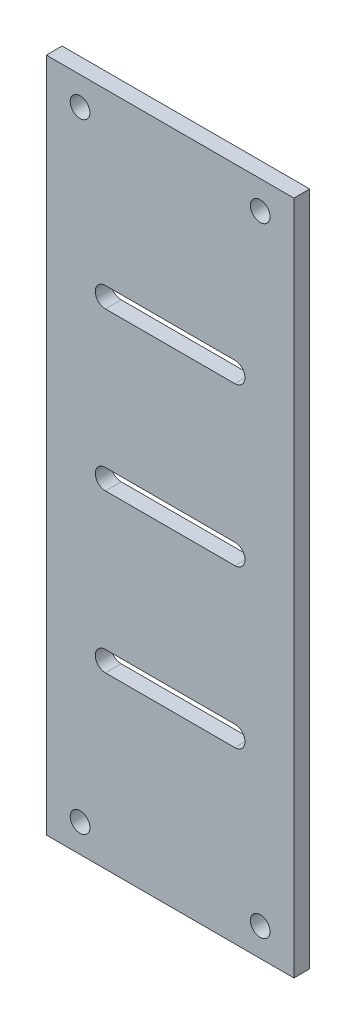
ISO-10303-21;
HEADER;
FILE_DESCRIPTION(('STEP AP214'),'2;1');
FILE_NAME('part.step','',(''),(''),'','','');
FILE_SCHEMA(('AUTOMOTIVE_DESIGN { 1 0 10303 214 1 1 1 1 }'));
ENDSEC;
DATA;
#1=APPLICATION_CONTEXT('core data for automotive mechanical design processes');
#2=APPLICATION_PROTOCOL_DEFINITION('international standard','automotive_design',2000,#1);
#3=PRODUCT_CONTEXT('',#1,'mechanical');
#4=PRODUCT('Part','Part','',(#3));
#5=PRODUCT_RELATED_PRODUCT_CATEGORY('part','',(#4));
#6=PRODUCT_DEFINITION_FORMATION('','',#4);
#7=PRODUCT_DEFINITION_CONTEXT('part definition',#1,'design');
#8=PRODUCT_DEFINITION('design','',#6,#7);
#9=PRODUCT_DEFINITION_SHAPE('','',#8);
#10=(LENGTH_UNIT() NAMED_UNIT(*) SI_UNIT(.MILLI.,.METRE.));
#11=(NAMED_UNIT(*) PLANE_ANGLE_UNIT() SI_UNIT($,.RADIAN.));
#12=(NAMED_UNIT(*) SI_UNIT($,.STERADIAN.) SOLID_ANGLE_UNIT());
#13=UNCERTAINTY_MEASURE_WITH_UNIT(LENGTH_MEASURE(1.E-05),#10,'distance_accuracy_value','');
#14=(GEOMETRIC_REPRESENTATION_CONTEXT(3) GLOBAL_UNCERTAINTY_ASSIGNED_CONTEXT((#13)) GLOBAL_UNIT_ASSIGNED_CONTEXT((#10,
#11,#12)) REPRESENTATION_CONTEXT('',''));
#15=CARTESIAN_POINT('',(0.,0.,0.));
#16=DIRECTION('',(0.,0.,1.));
#17=DIRECTION('',(1.,0.,0.));
#18=AXIS2_PLACEMENT_3D('',#15,#16,#17);
#19=CARTESIAN_POINT('',(0.,0.,2.8));
#20=DIRECTION('',(0.,0.,1.));
#21=DIRECTION('',(1.,0.,0.));
#22=AXIS2_PLACEMENT_3D('',#19,#20,#21);
#23=PLANE('',#22);
#24=CARTESIAN_POINT('',(16.,-55.,2.8));
#25=DIRECTION('',(0.,0.,1.));
#26=DIRECTION('',(1.,0.,0.));
#27=AXIS2_PLACEMENT_3D('',#24,#25,#26);
#28=CIRCLE('',#27,1.75);
#29=CARTESIAN_POINT('',(17.75,-55.,2.8));
#30=VERTEX_POINT('',#29);
#31=EDGE_CURVE('E301',#30,#30,#28,.T.);
#32=ORIENTED_EDGE('',*,*,#31,.F.);
#33=EDGE_LOOP('',(#32));
#34=FACE_BOUND('',#33,.T.);
#35=CARTESIAN_POINT('',(-16.,-55.,2.8));
#36=DIRECTION('',(0.,0.,1.));
#37=DIRECTION('',(1.,0.,0.));
#38=AXIS2_PLACEMENT_3D('',#35,#36,#37);
#39=CIRCLE('',#38,1.75);
#40=CARTESIAN_POINT('',(-14.25,-55.,2.8));
#41=VERTEX_POINT('',#40);
#42=EDGE_CURVE('E317',#41,#41,#39,.T.);
#43=ORIENTED_EDGE('',*,*,#42,.F.);
#44=EDGE_LOOP('',(#43));
#45=FACE_BOUND('',#44,.T.);
#46=DIRECTION('',(0.,-1.,0.));
#47=VECTOR('',#46,1.);
#48=CARTESIAN_POINT('',(-22.,60.,2.8));
#49=LINE('',#48,#47);
#50=CARTESIAN_POINT('',(-22.,60.,2.8));
#51=VERTEX_POINT('',#50);
#52=CARTESIAN_POINT('',(-22.,-60.,2.8));
#53=VERTEX_POINT('',#52);
#54=EDGE_CURVE('E325',#51,#53,#49,.T.);
#55=ORIENTED_EDGE('',*,*,#54,.T.);
#56=DIRECTION('',(1.,0.,0.));
#57=VECTOR('',#56,1.);
#58=CARTESIAN_POINT('',(-22.,-60.,2.8));
#59=LINE('',#58,#57);
#60=CARTESIAN_POINT('',(22.,-60.,2.8));
#61=VERTEX_POINT('',#60);
#62=EDGE_CURVE('E329',#53,#61,#59,.T.);
#63=ORIENTED_EDGE('',*,*,#62,.T.);
#64=DIRECTION('',(0.,1.,0.));
#65=VECTOR('',#64,1.);
#66=CARTESIAN_POINT('',(22.,-60.,2.8));
#67=LINE('',#66,#65);
#68=CARTESIAN_POINT('',(22.,60.,2.8));
#69=VERTEX_POINT('',#68);
#70=EDGE_CURVE('E333',#61,#69,#67,.T.);
#71=ORIENTED_EDGE('',*,*,#70,.T.);
#72=DIRECTION('',(-1.,0.,0.));
#73=VECTOR('',#72,1.);
#74=CARTESIAN_POINT('',(22.,60.,2.8));
#75=LINE('',#74,#73);
#76=EDGE_CURVE('E336',#69,#51,#75,.T.);
#77=ORIENTED_EDGE('',*,*,#76,.T.);
#78=EDGE_LOOP('',(#55,#63,#71,#77));
#79=FACE_BOUND('',#78,.T.);
#80=CARTESIAN_POINT('',(-16.,55.,2.8));
#81=DIRECTION('',(0.,0.,1.));
#82=DIRECTION('',(1.,0.,0.));
#83=AXIS2_PLACEMENT_3D('',#80,#81,#82);
#84=CIRCLE('',#83,1.75);
#85=CARTESIAN_POINT('',(-14.25,55.,2.8));
#86=VERTEX_POINT('',#85);
#87=EDGE_CURVE('E309',#86,#86,#84,.T.);
#88=ORIENTED_EDGE('',*,*,#87,.F.);
#89=EDGE_LOOP('',(#88));
#90=FACE_BOUND('',#89,.T.);
#91=CARTESIAN_POINT('',(16.,55.,2.8));
#92=DIRECTION('',(0.,0.,1.));
#93=DIRECTION('',(1.,0.,0.));
#94=AXIS2_PLACEMENT_3D('',#91,#92,#93);
#95=CIRCLE('',#94,1.75);
#96=CARTESIAN_POINT('',(17.75,55.,2.8));
#97=VERTEX_POINT('',#96);
#98=EDGE_CURVE('E294',#97,#97,#95,.T.);
#99=ORIENTED_EDGE('',*,*,#98,.F.);
#100=EDGE_LOOP('',(#99));
#101=FACE_BOUND('',#100,.T.);
#102=DIRECTION('',(1.,0.,0.));
#103=VECTOR('',#102,1.);
#104=CARTESIAN_POINT('',(-11.5,-29.8,2.8));
#105=LINE('',#104,#103);
#106=CARTESIAN_POINT('',(-11.5,-29.8,2.8));
#107=VERTEX_POINT('',#106);
#108=CARTESIAN_POINT('',(11.5,-29.8,2.8));
#109=VERTEX_POINT('',#108);
#110=EDGE_CURVE('E254',#107,#109,#105,.T.);
#111=ORIENTED_EDGE('',*,*,#110,.F.);
#112=CARTESIAN_POINT('',(-11.5,-28.,2.8));
#113=DIRECTION('',(0.,0.,1.));
#114=DIRECTION('',(1.,0.,0.));
#115=AXIS2_PLACEMENT_3D('',#112,#113,#114);
#116=CIRCLE('',#115,1.8);
#117=CARTESIAN_POINT('',(-11.5,-26.2,2.8));
#118=VERTEX_POINT('',#117);
#119=EDGE_CURVE('E251',#118,#107,#116,.T.);
#120=ORIENTED_EDGE('',*,*,#119,.F.);
#121=DIRECTION('',(-1.,0.,0.));
#122=VECTOR('',#121,1.);
#123=CARTESIAN_POINT('',(11.5,-26.2,2.8));
#124=LINE('',#123,#122);
#125=CARTESIAN_POINT('',(11.5,-26.2,2.8));
#126=VERTEX_POINT('',#125);
#127=EDGE_CURVE('E262',#126,#118,#124,.T.);
#128=ORIENTED_EDGE('',*,*,#127,.F.);
#129=CARTESIAN_POINT('',(11.5,-28.,2.8));
#130=DIRECTION('',(0.,0.,1.));
#131=DIRECTION('',(1.,0.,0.));
#132=AXIS2_PLACEMENT_3D('',#129,#130,#131);
#133=CIRCLE('',#132,1.8);
#134=EDGE_CURVE('E258',#109,#126,#133,.T.);
#135=ORIENTED_EDGE('',*,*,#134,.F.);
#136=EDGE_LOOP('',(#111,#120,#128,#135));
#137=FACE_BOUND('',#136,.T.);
#138=DIRECTION('',(1.,0.,0.));
#139=VECTOR('',#138,1.);
#140=CARTESIAN_POINT('',(-11.5,-1.8,2.8));
#141=LINE('',#140,#139);
#142=CARTESIAN_POINT('',(-11.5,-1.8,2.8));
#143=VERTEX_POINT('',#142);
#144=CARTESIAN_POINT('',(11.5,-1.8,2.8));
#145=VERTEX_POINT('',#144);
#146=EDGE_CURVE('E211',#143,#145,#141,.T.);
#147=ORIENTED_EDGE('',*,*,#146,.F.);
#148=CARTESIAN_POINT('',(-11.5,0.,2.8));
#149=DIRECTION('',(0.,0.,1.));
#150=DIRECTION('',(1.,0.,0.));
#151=AXIS2_PLACEMENT_3D('',#148,#149,#150);
#152=CIRCLE('',#151,1.8);
#153=CARTESIAN_POINT('',(-11.5,1.8,2.8));
#154=VERTEX_POINT('',#153);
#155=EDGE_CURVE('E208',#154,#143,#152,.T.);
#156=ORIENTED_EDGE('',*,*,#155,.F.);
#157=DIRECTION('',(-1.,0.,0.));
#158=VECTOR('',#157,1.);
#159=CARTESIAN_POINT('',(11.5,1.8,2.8));
#160=LINE('',#159,#158);
#161=CARTESIAN_POINT('',(11.5,1.8,2.8));
#162=VERTEX_POINT('',#161);
#163=EDGE_CURVE('E219',#162,#154,#160,.T.);
#164=ORIENTED_EDGE('',*,*,#163,.F.);
#165=CARTESIAN_POINT('',(11.5,0.,2.8));
#166=DIRECTION('',(0.,0.,1.));
#167=DIRECTION('',(1.,0.,0.));
#168=AXIS2_PLACEMENT_3D('',#165,#166,#167);
#169=CIRCLE('',#168,1.8);
#170=EDGE_CURVE('E215',#145,#162,#169,.T.);
#171=ORIENTED_EDGE('',*,*,#170,.F.);
#172=EDGE_LOOP('',(#147,#156,#164,#171));
#173=FACE_BOUND('',#172,.T.);
#174=DIRECTION('',(1.,0.,0.));
#175=VECTOR('',#174,1.);
#176=CARTESIAN_POINT('',(-11.5,26.2,2.8));
#177=LINE('',#176,#175);
#178=CARTESIAN_POINT('',(-11.5,26.2,2.8));
#179=VERTEX_POINT('',#178);
#180=CARTESIAN_POINT('',(11.5,26.2,2.8));
#181=VERTEX_POINT('',#180);
#182=EDGE_CURVE('E168',#179,#181,#177,.T.);
#183=ORIENTED_EDGE('',*,*,#182,.F.);
#184=CARTESIAN_POINT('',(-11.5,28.,2.8));
#185=DIRECTION('',(0.,0.,1.));
#186=DIRECTION('',(1.,0.,0.));
#187=AXIS2_PLACEMENT_3D('',#184,#185,#186);
#188=CIRCLE('',#187,1.8);
#189=CARTESIAN_POINT('',(-11.5,29.8,2.8));
#190=VERTEX_POINT('',#189);
#191=EDGE_CURVE('E159',#190,#179,#188,.T.);
#192=ORIENTED_EDGE('',*,*,#191,.F.);
#193=DIRECTION('',(-1.,0.,0.));
#194=VECTOR('',#193,1.);
#195=CARTESIAN_POINT('',(11.5,29.8,2.8));
#196=LINE('',#195,#194);
#197=CARTESIAN_POINT('',(11.5,29.8,2.8));
#198=VERTEX_POINT('',#197);
#199=EDGE_CURVE('E187',#198,#190,#196,.T.);
#200=ORIENTED_EDGE('',*,*,#199,.F.);
#201=CARTESIAN_POINT('',(11.5,28.,2.8));
#202=DIRECTION('',(0.,0.,1.));
#203=DIRECTION('',(1.,0.,0.));
#204=AXIS2_PLACEMENT_3D('',#201,#202,#203);
#205=CIRCLE('',#204,1.8);
#206=EDGE_CURVE('E181',#181,#198,#205,.T.);
#207=ORIENTED_EDGE('',*,*,#206,.F.);
#208=EDGE_LOOP('',(#183,#192,#200,#207));
#209=FACE_BOUND('',#208,.T.);
#210=ADVANCED_FACE('F45',(#34,#45,#79,#90,#101,#137,#173,#209),#23,.T.);
#211=CARTESIAN_POINT('',(0.,0.,0.));
#212=DIRECTION('',(0.,0.,1.));
#213=DIRECTION('',(1.,0.,0.));
#214=AXIS2_PLACEMENT_3D('',#211,#212,#213);
#215=PLANE('',#214);
#216=CARTESIAN_POINT('',(-11.5,0.,0.));
#217=DIRECTION('',(0.,0.,1.));
#218=DIRECTION('',(1.,0.,0.));
#219=AXIS2_PLACEMENT_3D('',#216,#217,#218);
#220=CIRCLE('',#219,1.8);
#221=CARTESIAN_POINT('',(-11.5,1.8,0.));
#222=VERTEX_POINT('',#221);
#223=CARTESIAN_POINT('',(-11.5,-1.8,0.));
#224=VERTEX_POINT('',#223);
#225=EDGE_CURVE('E177',#222,#224,#220,.T.);
#226=ORIENTED_EDGE('',*,*,#225,.T.);
#227=DIRECTION('',(1.,0.,0.));
#228=VECTOR('',#227,1.);
#229=CARTESIAN_POINT('',(-11.5,-1.8,0.));
#230=LINE('',#229,#228);
#231=CARTESIAN_POINT('',(11.5,-1.8,0.));
#232=VERTEX_POINT('',#231);
#233=EDGE_CURVE('E226',#224,#232,#230,.T.);
#234=ORIENTED_EDGE('',*,*,#233,.T.);
#235=CARTESIAN_POINT('',(11.5,0.,0.));
#236=DIRECTION('',(0.,0.,1.));
#237=DIRECTION('',(1.,0.,0.));
#238=AXIS2_PLACEMENT_3D('',#235,#236,#237);
#239=CIRCLE('',#238,1.8);
#240=CARTESIAN_POINT('',(11.5,1.8,0.));
#241=VERTEX_POINT('',#240);
#242=EDGE_CURVE('E230',#232,#241,#239,.T.);
#243=ORIENTED_EDGE('',*,*,#242,.T.);
#244=DIRECTION('',(-1.,0.,0.));
#245=VECTOR('',#244,1.);
#246=CARTESIAN_POINT('',(11.5,1.8,0.));
#247=LINE('',#246,#245);
#248=EDGE_CURVE('E212',#241,#222,#247,.T.);
#249=ORIENTED_EDGE('',*,*,#248,.T.);
#250=EDGE_LOOP('',(#226,#234,#243,#249));
#251=FACE_BOUND('',#250,.T.);
#252=CARTESIAN_POINT('',(16.,55.,0.));
#253=DIRECTION('',(0.,0.,1.));
#254=DIRECTION('',(1.,0.,0.));
#255=AXIS2_PLACEMENT_3D('',#252,#253,#254);
#256=CIRCLE('',#255,1.75);
#257=CARTESIAN_POINT('',(17.75,55.,0.));
#258=VERTEX_POINT('',#257);
#259=EDGE_CURVE('E293',#258,#258,#256,.T.);
#260=ORIENTED_EDGE('',*,*,#259,.T.);
#261=EDGE_LOOP('',(#260));
#262=FACE_BOUND('',#261,.T.);
#263=CARTESIAN_POINT('',(16.,-55.,0.));
#264=DIRECTION('',(0.,0.,1.));
#265=DIRECTION('',(1.,0.,0.));
#266=AXIS2_PLACEMENT_3D('',#263,#264,#265);
#267=CIRCLE('',#266,1.75);
#268=CARTESIAN_POINT('',(17.75,-55.,0.));
#269=VERTEX_POINT('',#268);
#270=EDGE_CURVE('E298',#269,#269,#267,.T.);
#271=ORIENTED_EDGE('',*,*,#270,.T.);
#272=EDGE_LOOP('',(#271));
#273=FACE_BOUND('',#272,.T.);
#274=CARTESIAN_POINT('',(-16.,55.,0.));
#275=DIRECTION('',(0.,0.,1.));
#276=DIRECTION('',(1.,0.,0.));
#277=AXIS2_PLACEMENT_3D('',#274,#275,#276);
#278=CIRCLE('',#277,1.75);
#279=CARTESIAN_POINT('',(-14.25,55.,0.));
#280=VERTEX_POINT('',#279);
#281=EDGE_CURVE('E305',#280,#280,#278,.T.);
#282=ORIENTED_EDGE('',*,*,#281,.T.);
#283=EDGE_LOOP('',(#282));
#284=FACE_BOUND('',#283,.T.);
#285=CARTESIAN_POINT('',(-16.,-55.,0.));
#286=DIRECTION('',(0.,0.,1.));
#287=DIRECTION('',(1.,0.,0.));
#288=AXIS2_PLACEMENT_3D('',#285,#286,#287);
#289=CIRCLE('',#288,1.75);
#290=CARTESIAN_POINT('',(-14.25,-55.,0.));
#291=VERTEX_POINT('',#290);
#292=EDGE_CURVE('E313',#291,#291,#289,.T.);
#293=ORIENTED_EDGE('',*,*,#292,.T.);
#294=EDGE_LOOP('',(#293));
#295=FACE_BOUND('',#294,.T.);
#296=DIRECTION('',(0.,-1.,0.));
#297=VECTOR('',#296,1.);
#298=CARTESIAN_POINT('',(-22.,60.,0.));
#299=LINE('',#298,#297);
#300=CARTESIAN_POINT('',(-22.,60.,0.));
#301=VERTEX_POINT('',#300);
#302=CARTESIAN_POINT('',(-22.,-60.,0.));
#303=VERTEX_POINT('',#302);
#304=EDGE_CURVE('E321',#301,#303,#299,.T.);
#305=ORIENTED_EDGE('',*,*,#304,.F.);
#306=DIRECTION('',(-1.,0.,0.));
#307=VECTOR('',#306,1.);
#308=CARTESIAN_POINT('',(22.,60.,0.));
#309=LINE('',#308,#307);
#310=CARTESIAN_POINT('',(22.,60.,0.));
#311=VERTEX_POINT('',#310);
#312=EDGE_CURVE('E330',#311,#301,#309,.T.);
#313=ORIENTED_EDGE('',*,*,#312,.F.);
#314=DIRECTION('',(0.,1.,0.));
#315=VECTOR('',#314,1.);
#316=CARTESIAN_POINT('',(22.,-60.,0.));
#317=LINE('',#316,#315);
#318=CARTESIAN_POINT('',(22.,-60.,0.));
#319=VERTEX_POINT('',#318);
#320=EDGE_CURVE('E346',#319,#311,#317,.T.);
#321=ORIENTED_EDGE('',*,*,#320,.F.);
#322=DIRECTION('',(1.,0.,0.));
#323=VECTOR('',#322,1.);
#324=CARTESIAN_POINT('',(-22.,-60.,0.));
#325=LINE('',#324,#323);
#326=EDGE_CURVE('E343',#303,#319,#325,.T.);
#327=ORIENTED_EDGE('',*,*,#326,.F.);
#328=EDGE_LOOP('',(#305,#313,#321,#327));
#329=FACE_BOUND('',#328,.T.);
#330=CARTESIAN_POINT('',(-11.5,-28.,0.));
#331=DIRECTION('',(0.,0.,1.));
#332=DIRECTION('',(1.,0.,0.));
#333=AXIS2_PLACEMENT_3D('',#330,#331,#332);
#334=CIRCLE('',#333,1.8);
#335=CARTESIAN_POINT('',(-11.5,-26.2,0.));
#336=VERTEX_POINT('',#335);
#337=CARTESIAN_POINT('',(-11.5,-29.8,0.));
#338=VERTEX_POINT('',#337);
#339=EDGE_CURVE('E250',#336,#338,#334,.T.);
#340=ORIENTED_EDGE('',*,*,#339,.T.);
#341=DIRECTION('',(1.,0.,0.));
#342=VECTOR('',#341,1.);
#343=CARTESIAN_POINT('',(-11.5,-29.8,0.));
#344=LINE('',#343,#342);
#345=CARTESIAN_POINT('',(11.5,-29.8,0.));
#346=VERTEX_POINT('',#345);
#347=EDGE_CURVE('E269',#338,#346,#344,.T.);
#348=ORIENTED_EDGE('',*,*,#347,.T.);
#349=CARTESIAN_POINT('',(11.5,-28.,0.));
#350=DIRECTION('',(0.,0.,1.));
#351=DIRECTION('',(1.,0.,0.));
#352=AXIS2_PLACEMENT_3D('',#349,#350,#351);
#353=CIRCLE('',#352,1.8);
#354=CARTESIAN_POINT('',(11.5,-26.2,0.));
#355=VERTEX_POINT('',#354);
#356=EDGE_CURVE('E273',#346,#355,#353,.T.);
#357=ORIENTED_EDGE('',*,*,#356,.T.);
#358=DIRECTION('',(-1.,0.,0.));
#359=VECTOR('',#358,1.);
#360=CARTESIAN_POINT('',(11.5,-26.2,0.));
#361=LINE('',#360,#359);
#362=EDGE_CURVE('E255',#355,#336,#361,.T.);
#363=ORIENTED_EDGE('',*,*,#362,.T.);
#364=EDGE_LOOP('',(#340,#348,#357,#363));
#365=FACE_BOUND('',#364,.T.);
#366=CARTESIAN_POINT('',(-11.5,28.,0.));
#367=DIRECTION('',(0.,0.,1.));
#368=DIRECTION('',(1.,0.,0.));
#369=AXIS2_PLACEMENT_3D('',#366,#367,#368);
#370=CIRCLE('',#369,1.8);
#371=CARTESIAN_POINT('',(-11.5,29.8,0.));
#372=VERTEX_POINT('',#371);
#373=CARTESIAN_POINT('',(-11.5,26.2,0.));
#374=VERTEX_POINT('',#373);
#375=EDGE_CURVE('E69',#372,#374,#370,.T.);
#376=ORIENTED_EDGE('',*,*,#375,.T.);
#377=DIRECTION('',(1.,0.,0.));
#378=VECTOR('',#377,1.);
#379=CARTESIAN_POINT('',(-11.5,26.2,0.));
#380=LINE('',#379,#378);
#381=CARTESIAN_POINT('',(11.5,26.2,0.));
#382=VERTEX_POINT('',#381);
#383=EDGE_CURVE('E175',#374,#382,#380,.T.);
#384=ORIENTED_EDGE('',*,*,#383,.T.);
#385=CARTESIAN_POINT('',(11.5,28.,0.));
#386=DIRECTION('',(0.,0.,1.));
#387=DIRECTION('',(1.,0.,0.));
#388=AXIS2_PLACEMENT_3D('',#385,#386,#387);
#389=CIRCLE('',#388,1.8);
#390=CARTESIAN_POINT('',(11.5,29.8,0.));
#391=VERTEX_POINT('',#390);
#392=EDGE_CURVE('E195',#382,#391,#389,.T.);
#393=ORIENTED_EDGE('',*,*,#392,.T.);
#394=DIRECTION('',(-1.,0.,0.));
#395=VECTOR('',#394,1.);
#396=CARTESIAN_POINT('',(11.5,29.8,0.));
#397=LINE('',#396,#395);
#398=EDGE_CURVE('E169',#391,#372,#397,.T.);
#399=ORIENTED_EDGE('',*,*,#398,.T.);
#400=EDGE_LOOP('',(#376,#384,#393,#399));
#401=FACE_BOUND('',#400,.T.);
#402=ADVANCED_FACE('F369',(#251,#262,#273,#284,#295,#329,#365,#401),#215,.F.);
#403=CARTESIAN_POINT('',(-22.,60.,2.8));
#404=DIRECTION('',(1.,0.,0.));
#405=DIRECTION('',(0.,0.,-1.));
#406=AXIS2_PLACEMENT_3D('',#403,#404,#405);
#407=PLANE('',#406);
#408=ORIENTED_EDGE('',*,*,#304,.T.);
#409=DIRECTION('',(0.,0.,-1.));
#410=VECTOR('',#409,1.);
#411=CARTESIAN_POINT('',(-22.,-60.,2.8));
#412=LINE('',#411,#410);
#413=EDGE_CURVE('E11',#53,#303,#412,.T.);
#414=ORIENTED_EDGE('',*,*,#413,.F.);
#415=ORIENTED_EDGE('',*,*,#54,.F.);
#416=DIRECTION('',(0.,0.,-1.));
#417=VECTOR('',#416,1.);
#418=CARTESIAN_POINT('',(-22.,60.,2.8));
#419=LINE('',#418,#417);
#420=EDGE_CURVE('E339',#51,#301,#419,.T.);
#421=ORIENTED_EDGE('',*,*,#420,.T.);
#422=EDGE_LOOP('',(#408,#414,#415,#421));
#423=FACE_BOUND('',#422,.T.);
#424=ADVANCED_FACE('F47',(#423),#407,.F.);
#425=CARTESIAN_POINT('',(-22.,-60.,2.8));
#426=DIRECTION('',(0.,1.,0.));
#427=DIRECTION('',(0.,0.,1.));
#428=AXIS2_PLACEMENT_3D('',#425,#426,#427);
#429=PLANE('',#428);
#430=ORIENTED_EDGE('',*,*,#326,.T.);
#431=DIRECTION('',(0.,0.,-1.));
#432=VECTOR('',#431,1.);
#433=CARTESIAN_POINT('',(22.,-60.,2.8));
#434=LINE('',#433,#432);
#435=EDGE_CURVE('E54',#61,#319,#434,.T.);
#436=ORIENTED_EDGE('',*,*,#435,.F.);
#437=ORIENTED_EDGE('',*,*,#62,.F.);
#438=ORIENTED_EDGE('',*,*,#413,.T.);
#439=EDGE_LOOP('',(#430,#436,#437,#438));
#440=FACE_BOUND('',#439,.T.);
#441=ADVANCED_FACE('F380',(#440),#429,.F.);
#442=CARTESIAN_POINT('',(22.,-60.,2.8));
#443=DIRECTION('',(-1.,0.,0.));
#444=DIRECTION('',(0.,0.,1.));
#445=AXIS2_PLACEMENT_3D('',#442,#443,#444);
#446=PLANE('',#445);
#447=ORIENTED_EDGE('',*,*,#320,.T.);
#448=DIRECTION('',(0.,0.,-1.));
#449=VECTOR('',#448,1.);
#450=CARTESIAN_POINT('',(22.,60.,2.8));
#451=LINE('',#450,#449);
#452=EDGE_CURVE('E354',#69,#311,#451,.T.);
#453=ORIENTED_EDGE('',*,*,#452,.F.);
#454=ORIENTED_EDGE('',*,*,#70,.F.);
#455=ORIENTED_EDGE('',*,*,#435,.T.);
#456=EDGE_LOOP('',(#447,#453,#454,#455));
#457=FACE_BOUND('',#456,.T.);
#458=ADVANCED_FACE('F363',(#457),#446,.F.);
#459=CARTESIAN_POINT('',(22.,60.,2.8));
#460=DIRECTION('',(0.,-1.,0.));
#461=DIRECTION('',(0.,0.,-1.));
#462=AXIS2_PLACEMENT_3D('',#459,#460,#461);
#463=PLANE('',#462);
#464=ORIENTED_EDGE('',*,*,#312,.T.);
#465=ORIENTED_EDGE('',*,*,#420,.F.);
#466=ORIENTED_EDGE('',*,*,#76,.F.);
#467=ORIENTED_EDGE('',*,*,#452,.T.);
#468=EDGE_LOOP('',(#464,#465,#466,#467));
#469=FACE_BOUND('',#468,.T.);
#470=ADVANCED_FACE('F373',(#469),#463,.F.);
#471=CARTESIAN_POINT('',(-16.,-55.,2.8));
#472=DIRECTION('',(0.,0.,-1.));
#473=DIRECTION('',(-1.,0.,0.));
#474=AXIS2_PLACEMENT_3D('',#471,#472,#473);
#475=CYLINDRICAL_SURFACE('',#474,1.75);
#476=ORIENTED_EDGE('',*,*,#42,.T.);
#477=EDGE_LOOP('',(#476));
#478=FACE_BOUND('',#477,.T.);
#479=ORIENTED_EDGE('',*,*,#292,.F.);
#480=EDGE_LOOP('',(#479));
#481=FACE_BOUND('',#480,.T.);
#482=ADVANCED_FACE('F396',(#478,#481),#475,.F.);
#483=CARTESIAN_POINT('',(-16.,55.,2.8));
#484=DIRECTION('',(0.,0.,-1.));
#485=DIRECTION('',(-1.,0.,0.));
#486=AXIS2_PLACEMENT_3D('',#483,#484,#485);
#487=CYLINDRICAL_SURFACE('',#486,1.75);
#488=ORIENTED_EDGE('',*,*,#87,.T.);
#489=EDGE_LOOP('',(#488));
#490=FACE_BOUND('',#489,.T.);
#491=ORIENTED_EDGE('',*,*,#281,.F.);
#492=EDGE_LOOP('',(#491));
#493=FACE_BOUND('',#492,.T.);
#494=ADVANCED_FACE('F402',(#490,#493),#487,.F.);
#495=CARTESIAN_POINT('',(16.,-55.,2.8));
#496=DIRECTION('',(0.,0.,-1.));
#497=DIRECTION('',(-1.,0.,0.));
#498=AXIS2_PLACEMENT_3D('',#495,#496,#497);
#499=CYLINDRICAL_SURFACE('',#498,1.75);
#500=ORIENTED_EDGE('',*,*,#31,.T.);
#501=EDGE_LOOP('',(#500));
#502=FACE_BOUND('',#501,.T.);
#503=ORIENTED_EDGE('',*,*,#270,.F.);
#504=EDGE_LOOP('',(#503));
#505=FACE_BOUND('',#504,.T.);
#506=ADVANCED_FACE('F406',(#502,#505),#499,.F.);
#507=CARTESIAN_POINT('',(16.,55.,2.8));
#508=DIRECTION('',(0.,0.,-1.));
#509=DIRECTION('',(-1.,0.,0.));
#510=AXIS2_PLACEMENT_3D('',#507,#508,#509);
#511=CYLINDRICAL_SURFACE('',#510,1.75);
#512=ORIENTED_EDGE('',*,*,#98,.T.);
#513=EDGE_LOOP('',(#512));
#514=FACE_BOUND('',#513,.T.);
#515=ORIENTED_EDGE('',*,*,#259,.F.);
#516=EDGE_LOOP('',(#515));
#517=FACE_BOUND('',#516,.T.);
#518=ADVANCED_FACE('F414',(#514,#517),#511,.F.);
#519=CARTESIAN_POINT('',(-11.5,-28.,2.8));
#520=DIRECTION('',(0.,0.,-1.));
#521=DIRECTION('',(-1.,0.,0.));
#522=AXIS2_PLACEMENT_3D('',#519,#520,#521);
#523=CYLINDRICAL_SURFACE('',#522,1.8);
#524=ORIENTED_EDGE('',*,*,#339,.F.);
#525=DIRECTION('',(0.,0.,-1.));
#526=VECTOR('',#525,1.);
#527=CARTESIAN_POINT('',(-11.5,-26.2,2.8));
#528=LINE('',#527,#526);
#529=EDGE_CURVE('E265',#118,#336,#528,.T.);
#530=ORIENTED_EDGE('',*,*,#529,.F.);
#531=ORIENTED_EDGE('',*,*,#119,.T.);
#532=DIRECTION('',(0.,0.,-1.));
#533=VECTOR('',#532,1.);
#534=CARTESIAN_POINT('',(-11.5,-29.8,2.8));
#535=LINE('',#534,#533);
#536=EDGE_CURVE('E289',#107,#338,#535,.T.);
#537=ORIENTED_EDGE('',*,*,#536,.T.);
#538=EDGE_LOOP('',(#524,#530,#531,#537));
#539=FACE_BOUND('',#538,.T.);
#540=ADVANCED_FACE('F421',(#539),#523,.F.);
#541=CARTESIAN_POINT('',(-11.5,-29.8,2.8));
#542=DIRECTION('',(0.,1.,0.));
#543=DIRECTION('',(0.,0.,1.));
#544=AXIS2_PLACEMENT_3D('',#541,#542,#543);
#545=PLANE('',#544);
#546=ORIENTED_EDGE('',*,*,#347,.F.);
#547=ORIENTED_EDGE('',*,*,#536,.F.);
#548=ORIENTED_EDGE('',*,*,#110,.T.);
#549=DIRECTION('',(0.,0.,-1.));
#550=VECTOR('',#549,1.);
#551=CARTESIAN_POINT('',(11.5,-29.8,2.8));
#552=LINE('',#551,#550);
#553=EDGE_CURVE('E286',#109,#346,#552,.T.);
#554=ORIENTED_EDGE('',*,*,#553,.T.);
#555=EDGE_LOOP('',(#546,#547,#548,#554));
#556=FACE_BOUND('',#555,.T.);
#557=ADVANCED_FACE('F425',(#556),#545,.T.);
#558=CARTESIAN_POINT('',(11.5,-28.,2.8));
#559=DIRECTION('',(0.,0.,-1.));
#560=DIRECTION('',(-1.,0.,0.));
#561=AXIS2_PLACEMENT_3D('',#558,#559,#560);
#562=CYLINDRICAL_SURFACE('',#561,1.8);
#563=ORIENTED_EDGE('',*,*,#356,.F.);
#564=ORIENTED_EDGE('',*,*,#553,.F.);
#565=ORIENTED_EDGE('',*,*,#134,.T.);
#566=DIRECTION('',(0.,0.,-1.));
#567=VECTOR('',#566,1.);
#568=CARTESIAN_POINT('',(11.5,-26.2,2.8));
#569=LINE('',#568,#567);
#570=EDGE_CURVE('E283',#126,#355,#569,.T.);
#571=ORIENTED_EDGE('',*,*,#570,.T.);
#572=EDGE_LOOP('',(#563,#564,#565,#571));
#573=FACE_BOUND('',#572,.T.);
#574=ADVANCED_FACE('F429',(#573),#562,.F.);
#575=CARTESIAN_POINT('',(11.5,-26.2,2.8));
#576=DIRECTION('',(0.,-1.,0.));
#577=DIRECTION('',(0.,0.,-1.));
#578=AXIS2_PLACEMENT_3D('',#575,#576,#577);
#579=PLANE('',#578);
#580=ORIENTED_EDGE('',*,*,#362,.F.);
#581=ORIENTED_EDGE('',*,*,#570,.F.);
#582=ORIENTED_EDGE('',*,*,#127,.T.);
#583=ORIENTED_EDGE('',*,*,#529,.T.);
#584=EDGE_LOOP('',(#580,#581,#582,#583));
#585=FACE_BOUND('',#584,.T.);
#586=ADVANCED_FACE('F433',(#585),#579,.T.);
#587=CARTESIAN_POINT('',(-11.5,0.,2.8));
#588=DIRECTION('',(0.,0.,-1.));
#589=DIRECTION('',(-1.,0.,0.));
#590=AXIS2_PLACEMENT_3D('',#587,#588,#589);
#591=CYLINDRICAL_SURFACE('',#590,1.8);
#592=ORIENTED_EDGE('',*,*,#225,.F.);
#593=DIRECTION('',(0.,0.,-1.));
#594=VECTOR('',#593,1.);
#595=CARTESIAN_POINT('',(-11.5,1.8,2.8));
#596=LINE('',#595,#594);
#597=EDGE_CURVE('E222',#154,#222,#596,.T.);
#598=ORIENTED_EDGE('',*,*,#597,.F.);
#599=ORIENTED_EDGE('',*,*,#155,.T.);
#600=DIRECTION('',(0.,0.,-1.));
#601=VECTOR('',#600,1.);
#602=CARTESIAN_POINT('',(-11.5,-1.8,2.8));
#603=LINE('',#602,#601);
#604=EDGE_CURVE('E246',#143,#224,#603,.T.);
#605=ORIENTED_EDGE('',*,*,#604,.T.);
#606=EDGE_LOOP('',(#592,#598,#599,#605));
#607=FACE_BOUND('',#606,.T.);
#608=ADVANCED_FACE('F437',(#607),#591,.F.);
#609=CARTESIAN_POINT('',(-11.5,-1.8,2.8));
#610=DIRECTION('',(0.,1.,0.));
#611=DIRECTION('',(0.,0.,1.));
#612=AXIS2_PLACEMENT_3D('',#609,#610,#611);
#613=PLANE('',#612);
#614=ORIENTED_EDGE('',*,*,#233,.F.);
#615=ORIENTED_EDGE('',*,*,#604,.F.);
#616=ORIENTED_EDGE('',*,*,#146,.T.);
#617=DIRECTION('',(0.,0.,-1.));
#618=VECTOR('',#617,1.);
#619=CARTESIAN_POINT('',(11.5,-1.8,2.8));
#620=LINE('',#619,#618);
#621=EDGE_CURVE('E243',#145,#232,#620,.T.);
#622=ORIENTED_EDGE('',*,*,#621,.T.);
#623=EDGE_LOOP('',(#614,#615,#616,#622));
#624=FACE_BOUND('',#623,.T.);
#625=ADVANCED_FACE('F441',(#624),#613,.T.);
#626=CARTESIAN_POINT('',(11.5,0.,2.8));
#627=DIRECTION('',(0.,0.,-1.));
#628=DIRECTION('',(-1.,0.,0.));
#629=AXIS2_PLACEMENT_3D('',#626,#627,#628);
#630=CYLINDRICAL_SURFACE('',#629,1.8);
#631=ORIENTED_EDGE('',*,*,#242,.F.);
#632=ORIENTED_EDGE('',*,*,#621,.F.);
#633=ORIENTED_EDGE('',*,*,#170,.T.);
#634=DIRECTION('',(0.,0.,-1.));
#635=VECTOR('',#634,1.);
#636=CARTESIAN_POINT('',(11.5,1.8,2.8));
#637=LINE('',#636,#635);
#638=EDGE_CURVE('E240',#162,#241,#637,.T.);
#639=ORIENTED_EDGE('',*,*,#638,.T.);
#640=EDGE_LOOP('',(#631,#632,#633,#639));
#641=FACE_BOUND('',#640,.T.);
#642=ADVANCED_FACE('F445',(#641),#630,.F.);
#643=CARTESIAN_POINT('',(11.5,1.8,2.8));
#644=DIRECTION('',(0.,-1.,0.));
#645=DIRECTION('',(0.,0.,-1.));
#646=AXIS2_PLACEMENT_3D('',#643,#644,#645);
#647=PLANE('',#646);
#648=ORIENTED_EDGE('',*,*,#248,.F.);
#649=ORIENTED_EDGE('',*,*,#638,.F.);
#650=ORIENTED_EDGE('',*,*,#163,.T.);
#651=ORIENTED_EDGE('',*,*,#597,.T.);
#652=EDGE_LOOP('',(#648,#649,#650,#651));
#653=FACE_BOUND('',#652,.T.);
#654=ADVANCED_FACE('F449',(#653),#647,.T.);
#655=CARTESIAN_POINT('',(-11.5,28.,2.8));
#656=DIRECTION('',(0.,0.,-1.));
#657=DIRECTION('',(-1.,0.,0.));
#658=AXIS2_PLACEMENT_3D('',#655,#656,#657);
#659=CYLINDRICAL_SURFACE('',#658,1.8);
#660=ORIENTED_EDGE('',*,*,#375,.F.);
#661=DIRECTION('',(0.,0.,-1.));
#662=VECTOR('',#661,1.);
#663=CARTESIAN_POINT('',(-11.5,29.8,2.8));
#664=LINE('',#663,#662);
#665=EDGE_CURVE('E163',#190,#372,#664,.T.);
#666=ORIENTED_EDGE('',*,*,#665,.F.);
#667=ORIENTED_EDGE('',*,*,#191,.T.);
#668=DIRECTION('',(0.,0.,-1.));
#669=VECTOR('',#668,1.);
#670=CARTESIAN_POINT('',(-11.5,26.2,2.8));
#671=LINE('',#670,#669);
#672=EDGE_CURVE('E162',#179,#374,#671,.T.);
#673=ORIENTED_EDGE('',*,*,#672,.T.);
#674=EDGE_LOOP('',(#660,#666,#667,#673));
#675=FACE_BOUND('',#674,.T.);
#676=ADVANCED_FACE('F161',(#675),#659,.F.);
#677=CARTESIAN_POINT('',(-11.5,26.2,2.8));
#678=DIRECTION('',(0.,1.,0.));
#679=DIRECTION('',(0.,0.,1.));
#680=AXIS2_PLACEMENT_3D('',#677,#678,#679);
#681=PLANE('',#680);
#682=ORIENTED_EDGE('',*,*,#383,.F.);
#683=ORIENTED_EDGE('',*,*,#672,.F.);
#684=ORIENTED_EDGE('',*,*,#182,.T.);
#685=DIRECTION('',(0.,0.,-1.));
#686=VECTOR('',#685,1.);
#687=CARTESIAN_POINT('',(11.5,26.2,2.8));
#688=LINE('',#687,#686);
#689=EDGE_CURVE('E178',#181,#382,#688,.T.);
#690=ORIENTED_EDGE('',*,*,#689,.T.);
#691=EDGE_LOOP('',(#682,#683,#684,#690));
#692=FACE_BOUND('',#691,.T.);
#693=ADVANCED_FACE('F172',(#692),#681,.T.);
#694=CARTESIAN_POINT('',(11.5,28.,2.8));
#695=DIRECTION('',(0.,0.,-1.));
#696=DIRECTION('',(-1.,0.,0.));
#697=AXIS2_PLACEMENT_3D('',#694,#695,#696);
#698=CYLINDRICAL_SURFACE('',#697,1.8);
#699=ORIENTED_EDGE('',*,*,#392,.F.);
#700=ORIENTED_EDGE('',*,*,#689,.F.);
#701=ORIENTED_EDGE('',*,*,#206,.T.);
#702=DIRECTION('',(0.,0.,-1.));
#703=VECTOR('',#702,1.);
#704=CARTESIAN_POINT('',(11.5,29.8,2.8));
#705=LINE('',#704,#703);
#706=EDGE_CURVE('E61',#198,#391,#705,.T.);
#707=ORIENTED_EDGE('',*,*,#706,.T.);
#708=EDGE_LOOP('',(#699,#700,#701,#707));
#709=FACE_BOUND('',#708,.T.);
#710=ADVANCED_FACE('F458',(#709),#698,.F.);
#711=CARTESIAN_POINT('',(11.5,29.8,2.8));
#712=DIRECTION('',(0.,-1.,0.));
#713=DIRECTION('',(0.,0.,-1.));
#714=AXIS2_PLACEMENT_3D('',#711,#712,#713);
#715=PLANE('',#714);
#716=ORIENTED_EDGE('',*,*,#398,.F.);
#717=ORIENTED_EDGE('',*,*,#706,.F.);
#718=ORIENTED_EDGE('',*,*,#199,.T.);
#719=ORIENTED_EDGE('',*,*,#665,.T.);
#720=EDGE_LOOP('',(#716,#717,#718,#719));
#721=FACE_BOUND('',#720,.T.);
#722=ADVANCED_FACE('F461',(#721),#715,.T.);
#723=CLOSED_SHELL('',(#210,#402,#424,#441,#458,#470,#482,#494,#506,#518,#540,#557,#574,#586,
#608,#625,#642,#654,#676,#693,#710,#722));
#724=MANIFOLD_SOLID_BREP('B2',#723);
#725=ADVANCED_BREP_SHAPE_REPRESENTATION('',(#18,#724),#14);
#726=SHAPE_DEFINITION_REPRESENTATION(#9,#725);
ENDSEC;
END-ISO-10303-21;
